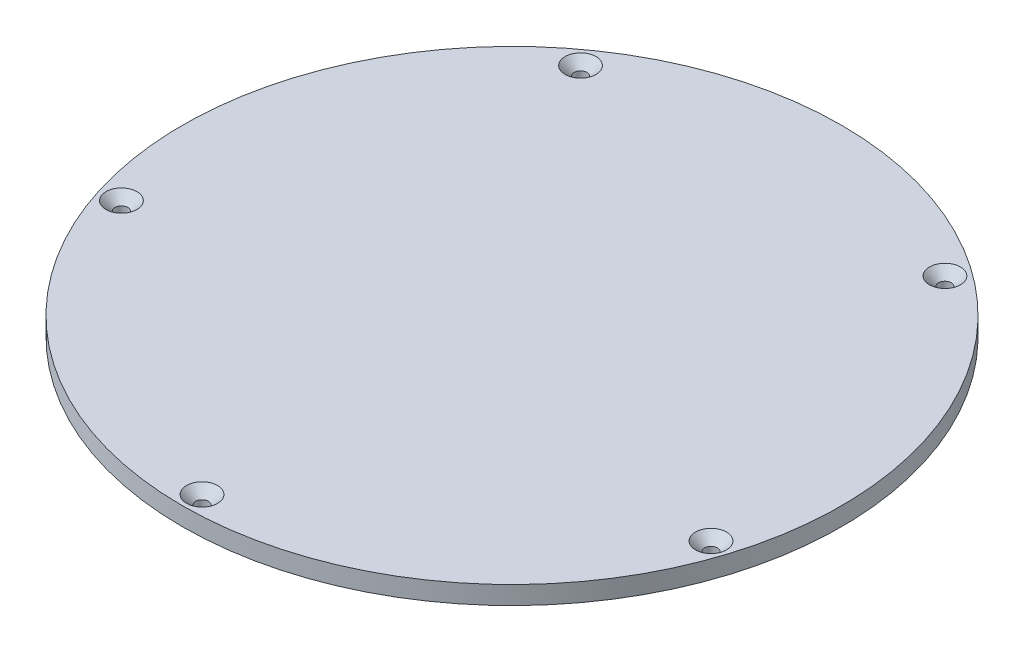
ISO-10303-21;
HEADER;
FILE_DESCRIPTION(('STEP AP214'),'2;1');
FILE_NAME('part.step','',(''),(''),'','','');
FILE_SCHEMA(('AUTOMOTIVE_DESIGN { 1 0 10303 214 1 1 1 1 }'));
ENDSEC;
DATA;
#1=APPLICATION_CONTEXT('core data for automotive mechanical design processes');
#2=APPLICATION_PROTOCOL_DEFINITION('international standard','automotive_design',2000,#1);
#3=PRODUCT_CONTEXT('',#1,'mechanical');
#4=PRODUCT('Part','Part','',(#3));
#5=PRODUCT_RELATED_PRODUCT_CATEGORY('part','',(#4));
#6=PRODUCT_DEFINITION_FORMATION('','',#4);
#7=PRODUCT_DEFINITION_CONTEXT('part definition',#1,'design');
#8=PRODUCT_DEFINITION('design','',#6,#7);
#9=PRODUCT_DEFINITION_SHAPE('','',#8);
#10=(LENGTH_UNIT() NAMED_UNIT(*) SI_UNIT(.MILLI.,.METRE.));
#11=(NAMED_UNIT(*) PLANE_ANGLE_UNIT() SI_UNIT($,.RADIAN.));
#12=(NAMED_UNIT(*) SI_UNIT($,.STERADIAN.) SOLID_ANGLE_UNIT());
#13=UNCERTAINTY_MEASURE_WITH_UNIT(LENGTH_MEASURE(1.E-05),#10,'distance_accuracy_value','');
#14=(GEOMETRIC_REPRESENTATION_CONTEXT(3) GLOBAL_UNCERTAINTY_ASSIGNED_CONTEXT((#13)) GLOBAL_UNIT_ASSIGNED_CONTEXT((#10,
#11,#12)) REPRESENTATION_CONTEXT('',''));
#15=CARTESIAN_POINT('',(0.,0.,0.));
#16=DIRECTION('',(0.,0.,1.));
#17=DIRECTION('',(1.,0.,0.));
#18=AXIS2_PLACEMENT_3D('',#15,#16,#17);
#19=CARTESIAN_POINT('',(-93.1720428349729,2.00000000000001,21.0131556174972));
#20=DIRECTION('',(0.,1.,0.));
#21=DIRECTION('',(-0.95105651629515,0.,0.309016994374958));
#22=AXIS2_PLACEMENT_3D('',#19,#20,#21);
#23=CONICAL_SURFACE('',#22,1.4,0.785398163397447);
#24=CARTESIAN_POINT('',(-93.1720428349729,4.,21.0131556174972));
#25=DIRECTION('',(0.,1.,0.));
#26=DIRECTION('',(-0.95105651629515,0.,0.309016994374958));
#27=AXIS2_PLACEMENT_3D('',#24,#25,#26);
#28=CIRCLE('',#27,3.39999999999999);
#29=CARTESIAN_POINT('',(-96.4056349903764,4.,22.063813398372));
#30=VERTEX_POINT('',#29);
#31=EDGE_CURVE('E10',#30,#30,#28,.F.);
#32=ORIENTED_EDGE('',*,*,#31,.F.);
#33=EDGE_LOOP('',(#32));
#34=FACE_BOUND('',#33,.T.);
#35=CARTESIAN_POINT('',(-93.1720428349729,2.00000000000001,21.0131556174972));
#36=DIRECTION('',(0.,1.,0.));
#37=DIRECTION('',(-0.95105651629515,0.,0.309016994374958));
#38=AXIS2_PLACEMENT_3D('',#35,#36,#37);
#39=CIRCLE('',#38,1.4);
#40=CARTESIAN_POINT('',(-94.5035219577861,2.00000000000001,21.4457794096221));
#41=VERTEX_POINT('',#40);
#42=EDGE_CURVE('E52',#41,#41,#39,.T.);
#43=ORIENTED_EDGE('',*,*,#42,.F.);
#44=EDGE_LOOP('',(#43));
#45=FACE_BOUND('',#44,.T.);
#46=ADVANCED_FACE('F41',(#34,#45),#23,.F.);
#47=CARTESIAN_POINT('',(-93.1720428349729,4.,21.0131556174972));
#48=DIRECTION('',(0.,-1.,0.));
#49=DIRECTION('',(0.95105651629515,0.,-0.309016994374958));
#50=AXIS2_PLACEMENT_3D('',#47,#48,#49);
#51=CYLINDRICAL_SURFACE('',#50,1.4);
#52=ORIENTED_EDGE('',*,*,#42,.T.);
#53=EDGE_LOOP('',(#52));
#54=FACE_BOUND('',#53,.T.);
#55=CARTESIAN_POINT('',(-93.1720428349729,0.,21.0131556174972));
#56=DIRECTION('',(0.,1.,0.));
#57=DIRECTION('',(-0.95105651629515,0.,0.309016994374958));
#58=AXIS2_PLACEMENT_3D('',#55,#56,#57);
#59=CIRCLE('',#58,1.4);
#60=CARTESIAN_POINT('',(-94.5035219577861,0.,21.4457794096221));
#61=VERTEX_POINT('',#60);
#62=EDGE_CURVE('E48',#61,#61,#59,.T.);
#63=ORIENTED_EDGE('',*,*,#62,.F.);
#64=EDGE_LOOP('',(#63));
#65=FACE_BOUND('',#64,.T.);
#66=ADVANCED_FACE('F123',(#54,#65),#51,.F.);
#67=CARTESIAN_POINT('',(-68.4695968827913,2.00000000000001,-55.0131556174961));
#68=DIRECTION('',(0.,1.,0.));
#69=DIRECTION('',(-0.58778525229248,0.,-0.809016994374942));
#70=AXIS2_PLACEMENT_3D('',#67,#68,#69);
#71=CONICAL_SURFACE('',#70,1.4,0.785398163397447);
#72=CARTESIAN_POINT('',(-68.4695968827913,4.,-55.0131556174961));
#73=DIRECTION('',(0.,1.,0.));
#74=DIRECTION('',(-0.58778525229248,0.,-0.809016994374942));
#75=AXIS2_PLACEMENT_3D('',#72,#73,#74);
#76=CIRCLE('',#75,3.39999999999999);
#77=CARTESIAN_POINT('',(-70.4680667405857,4.,-57.7638133983709));
#78=VERTEX_POINT('',#77);
#79=EDGE_CURVE('E56',#78,#78,#76,.F.);
#80=ORIENTED_EDGE('',*,*,#79,.F.);
#81=EDGE_LOOP('',(#80));
#82=FACE_BOUND('',#81,.T.);
#83=CARTESIAN_POINT('',(-68.4695968827913,2.00000000000001,-55.0131556174961));
#84=DIRECTION('',(0.,1.,0.));
#85=DIRECTION('',(-0.58778525229248,0.,-0.809016994374942));
#86=AXIS2_PLACEMENT_3D('',#83,#84,#85);
#87=CIRCLE('',#86,1.4);
#88=CARTESIAN_POINT('',(-69.2924962360008,2.00000000000001,-56.145779409621));
#89=VERTEX_POINT('',#88);
#90=EDGE_CURVE('E64',#89,#89,#87,.T.);
#91=ORIENTED_EDGE('',*,*,#90,.F.);
#92=EDGE_LOOP('',(#91));
#93=FACE_BOUND('',#92,.T.);
#94=ADVANCED_FACE('F128',(#82,#93),#71,.F.);
#95=CARTESIAN_POINT('',(-68.4695968827913,4.,-55.0131556174961));
#96=DIRECTION('',(0.,-1.,0.));
#97=DIRECTION('',(0.58778525229248,0.,0.809016994374942));
#98=AXIS2_PLACEMENT_3D('',#95,#96,#97);
#99=CYLINDRICAL_SURFACE('',#98,1.4);
#100=ORIENTED_EDGE('',*,*,#90,.T.);
#101=EDGE_LOOP('',(#100));
#102=FACE_BOUND('',#101,.T.);
#103=CARTESIAN_POINT('',(-68.4695968827913,0.,-55.0131556174961));
#104=DIRECTION('',(0.,1.,0.));
#105=DIRECTION('',(-0.58778525229248,0.,-0.809016994374942));
#106=AXIS2_PLACEMENT_3D('',#103,#104,#105);
#107=CIRCLE('',#106,1.4);
#108=CARTESIAN_POINT('',(-69.2924962360008,0.,-56.145779409621));
#109=VERTEX_POINT('',#108);
#110=EDGE_CURVE('E61',#109,#109,#107,.T.);
#111=ORIENTED_EDGE('',*,*,#110,.F.);
#112=EDGE_LOOP('',(#111));
#113=FACE_BOUND('',#112,.T.);
#114=ADVANCED_FACE('F136',(#102,#113),#99,.F.);
#115=CARTESIAN_POINT('',(11.4691974289852,2.00000000000001,-55.0131556174967));
#116=DIRECTION('',(0.,1.,0.));
#117=DIRECTION('',(0.587785252292469,0.,-0.809016994374951));
#118=AXIS2_PLACEMENT_3D('',#115,#116,#117);
#119=CONICAL_SURFACE('',#118,1.4,0.785398163397447);
#120=CARTESIAN_POINT('',(11.4691974289852,4.,-55.0131556174967));
#121=DIRECTION('',(0.,1.,0.));
#122=DIRECTION('',(0.587785252292469,0.,-0.809016994374951));
#123=AXIS2_PLACEMENT_3D('',#120,#121,#122);
#124=CIRCLE('',#123,3.39999999999999);
#125=CARTESIAN_POINT('',(13.4676672867796,4.,-57.7638133983715));
#126=VERTEX_POINT('',#125);
#127=EDGE_CURVE('E67',#126,#126,#124,.F.);
#128=ORIENTED_EDGE('',*,*,#127,.F.);
#129=EDGE_LOOP('',(#128));
#130=FACE_BOUND('',#129,.T.);
#131=CARTESIAN_POINT('',(11.4691974289852,2.00000000000001,-55.0131556174967));
#132=DIRECTION('',(0.,1.,0.));
#133=DIRECTION('',(0.587785252292469,0.,-0.809016994374951));
#134=AXIS2_PLACEMENT_3D('',#131,#132,#133);
#135=CIRCLE('',#134,1.4);
#136=CARTESIAN_POINT('',(12.2920967821947,2.00000000000001,-56.1457794096216));
#137=VERTEX_POINT('',#136);
#138=EDGE_CURVE('E73',#137,#137,#135,.T.);
#139=ORIENTED_EDGE('',*,*,#138,.F.);
#140=EDGE_LOOP('',(#139));
#141=FACE_BOUND('',#140,.T.);
#142=ADVANCED_FACE('F146',(#130,#141),#119,.F.);
#143=CARTESIAN_POINT('',(11.4691974289852,4.,-55.0131556174967));
#144=DIRECTION('',(0.,-1.,0.));
#145=DIRECTION('',(-0.587785252292469,0.,0.809016994374951));
#146=AXIS2_PLACEMENT_3D('',#143,#144,#145);
#147=CYLINDRICAL_SURFACE('',#146,1.4);
#148=ORIENTED_EDGE('',*,*,#138,.T.);
#149=EDGE_LOOP('',(#148));
#150=FACE_BOUND('',#149,.T.);
#151=CARTESIAN_POINT('',(11.4691974289852,0.,-55.0131556174967));
#152=DIRECTION('',(0.,1.,0.));
#153=DIRECTION('',(0.587785252292469,0.,-0.809016994374951));
#154=AXIS2_PLACEMENT_3D('',#151,#152,#153);
#155=CIRCLE('',#154,1.4);
#156=CARTESIAN_POINT('',(12.2920967821947,0.,-56.1457794096216));
#157=VERTEX_POINT('',#156);
#158=EDGE_CURVE('E70',#157,#157,#155,.T.);
#159=ORIENTED_EDGE('',*,*,#158,.F.);
#160=EDGE_LOOP('',(#159));
#161=FACE_BOUND('',#160,.T.);
#162=ADVANCED_FACE('F153',(#150,#161),#147,.F.);
#163=CARTESIAN_POINT('',(36.1716433811679,2.00000000000001,21.0131556174962));
#164=DIRECTION('',(0.,1.,0.));
#165=DIRECTION('',(0.951056516295155,0.,0.309016994374945));
#166=AXIS2_PLACEMENT_3D('',#163,#164,#165);
#167=CONICAL_SURFACE('',#166,1.4,0.785398163397447);
#168=CARTESIAN_POINT('',(36.1716433811679,4.,21.0131556174962));
#169=DIRECTION('',(0.,1.,0.));
#170=DIRECTION('',(0.951056516295155,0.,0.309016994374945));
#171=AXIS2_PLACEMENT_3D('',#168,#169,#170);
#172=CIRCLE('',#171,3.39999999999999);
#173=CARTESIAN_POINT('',(39.4052355365714,4.,22.063813398371));
#174=VERTEX_POINT('',#173);
#175=EDGE_CURVE('E76',#174,#174,#172,.F.);
#176=ORIENTED_EDGE('',*,*,#175,.F.);
#177=EDGE_LOOP('',(#176));
#178=FACE_BOUND('',#177,.T.);
#179=CARTESIAN_POINT('',(36.1716433811679,2.00000000000001,21.0131556174962));
#180=DIRECTION('',(0.,1.,0.));
#181=DIRECTION('',(0.951056516295155,0.,0.309016994374945));
#182=AXIS2_PLACEMENT_3D('',#179,#180,#181);
#183=CIRCLE('',#182,1.4);
#184=CARTESIAN_POINT('',(37.5031225039811,2.00000000000001,21.4457794096212));
#185=VERTEX_POINT('',#184);
#186=EDGE_CURVE('E82',#185,#185,#183,.T.);
#187=ORIENTED_EDGE('',*,*,#186,.F.);
#188=EDGE_LOOP('',(#187));
#189=FACE_BOUND('',#188,.T.);
#190=ADVANCED_FACE('F157',(#178,#189),#167,.F.);
#191=CARTESIAN_POINT('',(36.1716433811679,4.,21.0131556174962));
#192=DIRECTION('',(0.,-1.,0.));
#193=DIRECTION('',(-0.951056516295155,0.,-0.309016994374945));
#194=AXIS2_PLACEMENT_3D('',#191,#192,#193);
#195=CYLINDRICAL_SURFACE('',#194,1.4);
#196=ORIENTED_EDGE('',*,*,#186,.T.);
#197=EDGE_LOOP('',(#196));
#198=FACE_BOUND('',#197,.T.);
#199=CARTESIAN_POINT('',(36.1716433811679,0.,21.0131556174962));
#200=DIRECTION('',(0.,1.,0.));
#201=DIRECTION('',(0.951056516295155,0.,0.309016994374945));
#202=AXIS2_PLACEMENT_3D('',#199,#200,#201);
#203=CIRCLE('',#202,1.4);
#204=CARTESIAN_POINT('',(37.5031225039811,0.,21.4457794096212));
#205=VERTEX_POINT('',#204);
#206=EDGE_CURVE('E79',#205,#205,#203,.T.);
#207=ORIENTED_EDGE('',*,*,#206,.F.);
#208=EDGE_LOOP('',(#207));
#209=FACE_BOUND('',#208,.T.);
#210=ADVANCED_FACE('F164',(#198,#209),#195,.F.);
#211=CARTESIAN_POINT('',(-28.5001997269026,4.,68.));
#212=DIRECTION('',(0.,-1.,0.));
#213=DIRECTION('',(0.,0.,-1.));
#214=AXIS2_PLACEMENT_3D('',#211,#212,#213);
#215=CYLINDRICAL_SURFACE('',#214,1.4);
#216=CARTESIAN_POINT('',(-28.5001997269026,2.00000000000001,68.));
#217=DIRECTION('',(0.,1.,0.));
#218=DIRECTION('',(0.,0.,1.));
#219=AXIS2_PLACEMENT_3D('',#216,#217,#218);
#220=CIRCLE('',#219,1.4);
#221=CARTESIAN_POINT('',(-28.5001997269026,2.00000000000001,69.4));
#222=VERTEX_POINT('',#221);
#223=EDGE_CURVE('E88',#222,#222,#220,.T.);
#224=ORIENTED_EDGE('',*,*,#223,.T.);
#225=EDGE_LOOP('',(#224));
#226=FACE_BOUND('',#225,.T.);
#227=CARTESIAN_POINT('',(-28.5001997269026,0.,68.));
#228=DIRECTION('',(0.,1.,0.));
#229=DIRECTION('',(0.,0.,1.));
#230=AXIS2_PLACEMENT_3D('',#227,#228,#229);
#231=CIRCLE('',#230,1.4);
#232=CARTESIAN_POINT('',(-28.5001997269026,0.,69.4));
#233=VERTEX_POINT('',#232);
#234=EDGE_CURVE('E95',#233,#233,#231,.T.);
#235=ORIENTED_EDGE('',*,*,#234,.F.);
#236=EDGE_LOOP('',(#235));
#237=FACE_BOUND('',#236,.T.);
#238=ADVANCED_FACE('F106',(#226,#237),#215,.F.);
#239=CARTESIAN_POINT('',(-28.5001997269026,4.,0.));
#240=DIRECTION('',(0.,-1.,0.));
#241=DIRECTION('',(0.,0.,-1.));
#242=AXIS2_PLACEMENT_3D('',#239,#240,#241);
#243=CYLINDRICAL_SURFACE('',#242,72.3);
#244=CARTESIAN_POINT('',(-28.5001997269026,4.,0.));
#245=DIRECTION('',(0.,1.,0.));
#246=DIRECTION('',(0.,0.,1.));
#247=AXIS2_PLACEMENT_3D('',#244,#245,#246);
#248=CIRCLE('',#247,72.3);
#249=CARTESIAN_POINT('',(-28.5001997269026,4.,72.3));
#250=VERTEX_POINT('',#249);
#251=EDGE_CURVE('E91',#250,#250,#248,.T.);
#252=ORIENTED_EDGE('',*,*,#251,.F.);
#253=EDGE_LOOP('',(#252));
#254=FACE_BOUND('',#253,.T.);
#255=CARTESIAN_POINT('',(-28.5001997269026,0.,0.));
#256=DIRECTION('',(0.,1.,0.));
#257=DIRECTION('',(0.,0.,1.));
#258=AXIS2_PLACEMENT_3D('',#255,#256,#257);
#259=CIRCLE('',#258,72.3);
#260=CARTESIAN_POINT('',(-28.5001997269026,0.,72.3));
#261=VERTEX_POINT('',#260);
#262=EDGE_CURVE('E92',#261,#261,#259,.T.);
#263=ORIENTED_EDGE('',*,*,#262,.T.);
#264=EDGE_LOOP('',(#263));
#265=FACE_BOUND('',#264,.T.);
#266=ADVANCED_FACE('F103',(#254,#265),#243,.T.);
#267=CARTESIAN_POINT('',(0.,4.,0.));
#268=DIRECTION('',(0.,1.,0.));
#269=DIRECTION('',(0.,0.,1.));
#270=AXIS2_PLACEMENT_3D('',#267,#268,#269);
#271=PLANE('',#270);
#272=ORIENTED_EDGE('',*,*,#31,.T.);
#273=EDGE_LOOP('',(#272));
#274=FACE_BOUND('',#273,.T.);
#275=ORIENTED_EDGE('',*,*,#79,.T.);
#276=EDGE_LOOP('',(#275));
#277=FACE_BOUND('',#276,.T.);
#278=ORIENTED_EDGE('',*,*,#127,.T.);
#279=EDGE_LOOP('',(#278));
#280=FACE_BOUND('',#279,.T.);
#281=ORIENTED_EDGE('',*,*,#175,.T.);
#282=EDGE_LOOP('',(#281));
#283=FACE_BOUND('',#282,.T.);
#284=CARTESIAN_POINT('',(-28.5001997269026,4.,68.));
#285=DIRECTION('',(0.,1.,0.));
#286=DIRECTION('',(0.,0.,1.));
#287=AXIS2_PLACEMENT_3D('',#284,#285,#286);
#288=CIRCLE('',#287,3.39999999999999);
#289=CARTESIAN_POINT('',(-28.5001997269026,4.,71.4));
#290=VERTEX_POINT('',#289);
#291=EDGE_CURVE('E85',#290,#290,#288,.F.);
#292=ORIENTED_EDGE('',*,*,#291,.T.);
#293=EDGE_LOOP('',(#292));
#294=FACE_BOUND('',#293,.T.);
#295=ORIENTED_EDGE('',*,*,#251,.T.);
#296=EDGE_LOOP('',(#295));
#297=FACE_BOUND('',#296,.T.);
#298=ADVANCED_FACE('F101',(#274,#277,#280,#283,#294,#297),#271,.T.);
#299=CARTESIAN_POINT('',(0.,0.,0.));
#300=DIRECTION('',(0.,1.,0.));
#301=DIRECTION('',(0.,0.,1.));
#302=AXIS2_PLACEMENT_3D('',#299,#300,#301);
#303=PLANE('',#302);
#304=ORIENTED_EDGE('',*,*,#62,.T.);
#305=EDGE_LOOP('',(#304));
#306=FACE_BOUND('',#305,.T.);
#307=ORIENTED_EDGE('',*,*,#110,.T.);
#308=EDGE_LOOP('',(#307));
#309=FACE_BOUND('',#308,.T.);
#310=ORIENTED_EDGE('',*,*,#158,.T.);
#311=EDGE_LOOP('',(#310));
#312=FACE_BOUND('',#311,.T.);
#313=ORIENTED_EDGE('',*,*,#206,.T.);
#314=EDGE_LOOP('',(#313));
#315=FACE_BOUND('',#314,.T.);
#316=ORIENTED_EDGE('',*,*,#234,.T.);
#317=EDGE_LOOP('',(#316));
#318=FACE_BOUND('',#317,.T.);
#319=ORIENTED_EDGE('',*,*,#262,.F.);
#320=EDGE_LOOP('',(#319));
#321=FACE_BOUND('',#320,.T.);
#322=ADVANCED_FACE('F110',(#306,#309,#312,#315,#318,#321),#303,.F.);
#323=CARTESIAN_POINT('',(-28.5001997269026,2.00000000000001,68.));
#324=DIRECTION('',(0.,1.,0.));
#325=DIRECTION('',(0.,0.,1.));
#326=AXIS2_PLACEMENT_3D('',#323,#324,#325);
#327=CONICAL_SURFACE('',#326,1.4,0.785398163397447);
#328=ORIENTED_EDGE('',*,*,#291,.F.);
#329=EDGE_LOOP('',(#328));
#330=FACE_BOUND('',#329,.T.);
#331=ORIENTED_EDGE('',*,*,#223,.F.);
#332=EDGE_LOOP('',(#331));
#333=FACE_BOUND('',#332,.T.);
#334=ADVANCED_FACE('F112',(#330,#333),#327,.F.);
#335=CLOSED_SHELL('',(#46,#66,#94,#114,#142,#162,#190,#210,#238,#266,#298,#322,#334));
#336=MANIFOLD_SOLID_BREP('B2',#335);
#337=ADVANCED_BREP_SHAPE_REPRESENTATION('',(#18,#336),#14);
#338=SHAPE_DEFINITION_REPRESENTATION(#9,#337);
ENDSEC;
END-ISO-10303-21;
